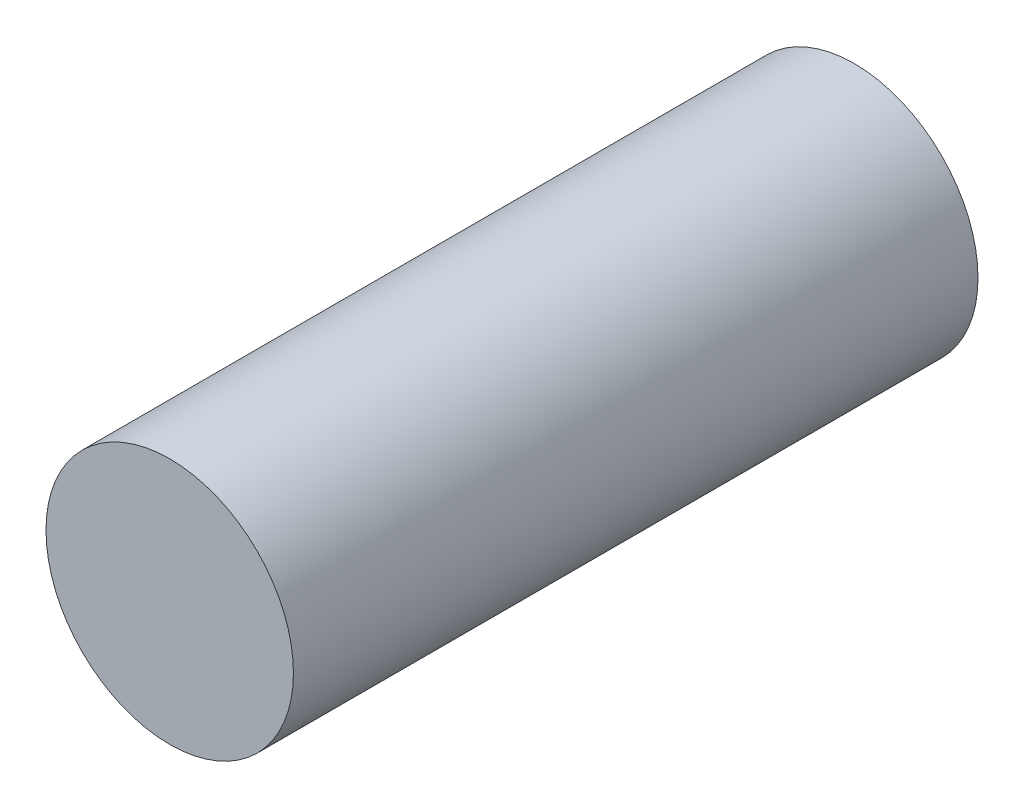
ISO-10303-21;
HEADER;
FILE_DESCRIPTION(('STEP AP214'),'2;1');
FILE_NAME('part.step','',(''),(''),'','','');
FILE_SCHEMA(('AUTOMOTIVE_DESIGN { 1 0 10303 214 1 1 1 1 }'));
ENDSEC;
DATA;
#1=APPLICATION_CONTEXT('core data for automotive mechanical design processes');
#2=APPLICATION_PROTOCOL_DEFINITION('international standard','automotive_design',2000,#1);
#3=PRODUCT_CONTEXT('',#1,'mechanical');
#4=PRODUCT('Part','Part','',(#3));
#5=PRODUCT_RELATED_PRODUCT_CATEGORY('part','',(#4));
#6=PRODUCT_DEFINITION_FORMATION('','',#4);
#7=PRODUCT_DEFINITION_CONTEXT('part definition',#1,'design');
#8=PRODUCT_DEFINITION('design','',#6,#7);
#9=PRODUCT_DEFINITION_SHAPE('','',#8);
#10=(LENGTH_UNIT() NAMED_UNIT(*) SI_UNIT(.MILLI.,.METRE.));
#11=(NAMED_UNIT(*) PLANE_ANGLE_UNIT() SI_UNIT($,.RADIAN.));
#12=(NAMED_UNIT(*) SI_UNIT($,.STERADIAN.) SOLID_ANGLE_UNIT());
#13=UNCERTAINTY_MEASURE_WITH_UNIT(LENGTH_MEASURE(1.E-05),#10,'distance_accuracy_value','');
#14=(GEOMETRIC_REPRESENTATION_CONTEXT(3) GLOBAL_UNCERTAINTY_ASSIGNED_CONTEXT((#13)) GLOBAL_UNIT_ASSIGNED_CONTEXT((#10,
#11,#12)) REPRESENTATION_CONTEXT('',''));
#15=CARTESIAN_POINT('',(0.,0.,0.));
#16=DIRECTION('',(0.,0.,1.));
#17=DIRECTION('',(1.,0.,0.));
#18=AXIS2_PLACEMENT_3D('',#15,#16,#17);
#19=CARTESIAN_POINT('',(0.,0.,41.5));
#20=DIRECTION('',(0.,0.,-1.));
#21=DIRECTION('',(-1.,0.,0.));
#22=AXIS2_PLACEMENT_3D('',#19,#20,#21);
#23=CYLINDRICAL_SURFACE('',#22,7.5);
#24=CARTESIAN_POINT('',(0.,0.,41.5));
#25=DIRECTION('',(0.,0.,1.));
#26=DIRECTION('',(1.,0.,0.));
#27=AXIS2_PLACEMENT_3D('',#24,#25,#26);
#28=CIRCLE('',#27,7.5);
#29=CARTESIAN_POINT('',(7.5,0.,41.5));
#30=VERTEX_POINT('',#29);
#31=EDGE_CURVE('E10',#30,#30,#28,.T.);
#32=ORIENTED_EDGE('',*,*,#31,.F.);
#33=EDGE_LOOP('',(#32));
#34=FACE_BOUND('',#33,.T.);
#35=CARTESIAN_POINT('',(0.,0.,0.));
#36=DIRECTION('',(0.,0.,1.));
#37=DIRECTION('',(1.,0.,0.));
#38=AXIS2_PLACEMENT_3D('',#35,#36,#37);
#39=CIRCLE('',#38,7.5);
#40=CARTESIAN_POINT('',(7.5,0.,0.));
#41=VERTEX_POINT('',#40);
#42=EDGE_CURVE('E48',#41,#41,#39,.T.);
#43=ORIENTED_EDGE('',*,*,#42,.T.);
#44=EDGE_LOOP('',(#43));
#45=FACE_BOUND('',#44,.T.);
#46=ADVANCED_FACE('F45',(#34,#45),#23,.T.);
#47=CARTESIAN_POINT('',(0.,0.,41.5));
#48=DIRECTION('',(0.,0.,1.));
#49=DIRECTION('',(1.,0.,0.));
#50=AXIS2_PLACEMENT_3D('',#47,#48,#49);
#51=PLANE('',#50);
#52=ORIENTED_EDGE('',*,*,#31,.T.);
#53=EDGE_LOOP('',(#52));
#54=FACE_BOUND('',#53,.T.);
#55=ADVANCED_FACE('F62',(#54),#51,.T.);
#56=CARTESIAN_POINT('',(0.,0.,0.));
#57=DIRECTION('',(0.,0.,1.));
#58=DIRECTION('',(1.,0.,0.));
#59=AXIS2_PLACEMENT_3D('',#56,#57,#58);
#60=PLANE('',#59);
#61=ORIENTED_EDGE('',*,*,#42,.F.);
#62=EDGE_LOOP('',(#61));
#63=FACE_BOUND('',#62,.T.);
#64=ADVANCED_FACE('F60',(#63),#60,.F.);
#65=CLOSED_SHELL('',(#46,#55,#64));
#66=MANIFOLD_SOLID_BREP('B2',#65);
#67=ADVANCED_BREP_SHAPE_REPRESENTATION('',(#18,#66),#14);
#68=SHAPE_DEFINITION_REPRESENTATION(#9,#67);
ENDSEC;
END-ISO-10303-21;
